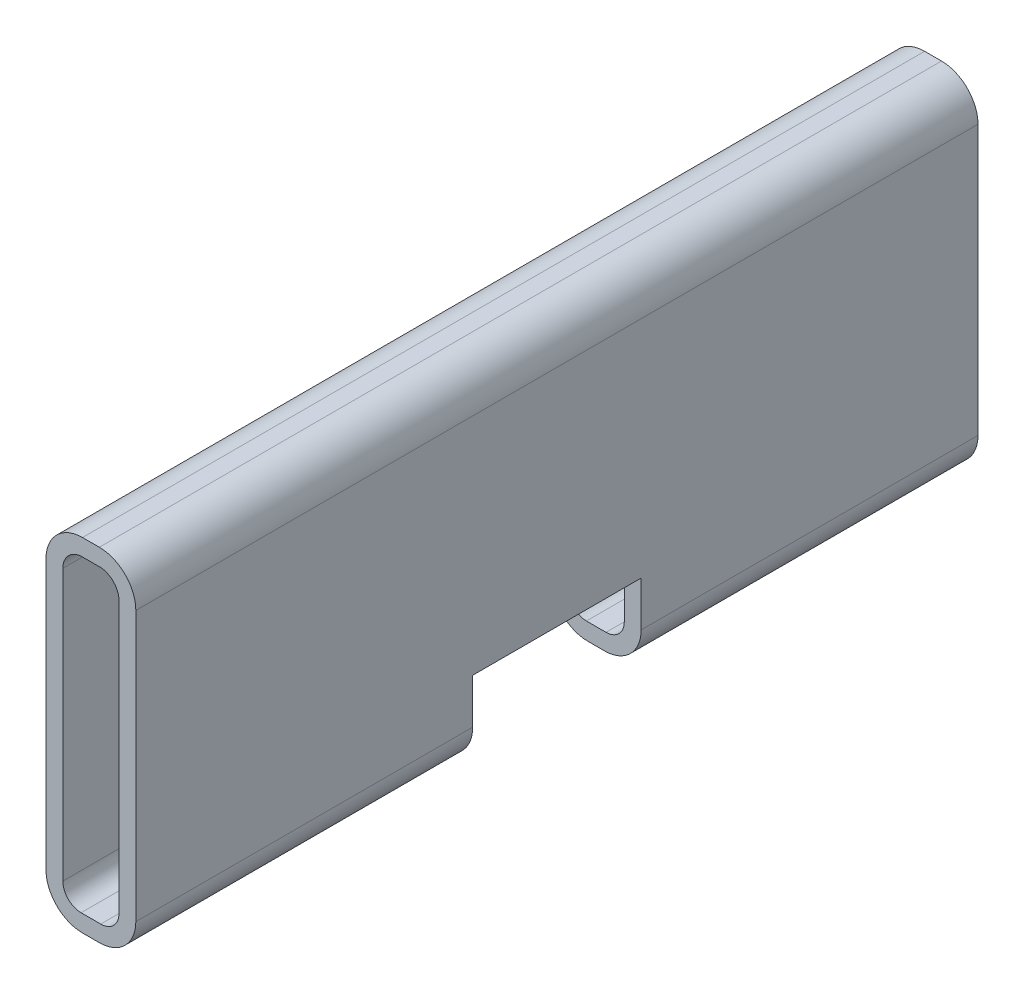
ISO-10303-21;
HEADER;
FILE_DESCRIPTION(('STEP AP214'),'2;1');
FILE_NAME('part.step','',(''),(''),'','','');
FILE_SCHEMA(('AUTOMOTIVE_DESIGN { 1 0 10303 214 1 1 1 1 }'));
ENDSEC;
DATA;
#1=APPLICATION_CONTEXT('core data for automotive mechanical design processes');
#2=APPLICATION_PROTOCOL_DEFINITION('international standard','automotive_design',2000,#1);
#3=PRODUCT_CONTEXT('',#1,'mechanical');
#4=PRODUCT('Part','Part','',(#3));
#5=PRODUCT_RELATED_PRODUCT_CATEGORY('part','',(#4));
#6=PRODUCT_DEFINITION_FORMATION('','',#4);
#7=PRODUCT_DEFINITION_CONTEXT('part definition',#1,'design');
#8=PRODUCT_DEFINITION('design','',#6,#7);
#9=PRODUCT_DEFINITION_SHAPE('','',#8);
#10=(LENGTH_UNIT() NAMED_UNIT(*) SI_UNIT(.MILLI.,.METRE.));
#11=(NAMED_UNIT(*) PLANE_ANGLE_UNIT() SI_UNIT($,.RADIAN.));
#12=(NAMED_UNIT(*) SI_UNIT($,.STERADIAN.) SOLID_ANGLE_UNIT());
#13=UNCERTAINTY_MEASURE_WITH_UNIT(LENGTH_MEASURE(1.E-05),#10,'distance_accuracy_value','');
#14=(GEOMETRIC_REPRESENTATION_CONTEXT(3) GLOBAL_UNCERTAINTY_ASSIGNED_CONTEXT((#13)) GLOBAL_UNIT_ASSIGNED_CONTEXT((#10,
#11,#12)) REPRESENTATION_CONTEXT('',''));
#15=CARTESIAN_POINT('',(0.,0.,0.));
#16=DIRECTION('',(0.,0.,1.));
#17=DIRECTION('',(1.,0.,0.));
#18=AXIS2_PLACEMENT_3D('',#15,#16,#17);
#19=CARTESIAN_POINT('',(0.,0.,60.));
#20=DIRECTION('',(0.,0.,1.));
#21=DIRECTION('',(1.,0.,0.));
#22=AXIS2_PLACEMENT_3D('',#19,#20,#21);
#23=PLANE('',#22);
#24=DIRECTION('',(1.,0.,0.));
#25=VECTOR('',#24,1.);
#26=CARTESIAN_POINT('',(-16.,14.5,60.));
#27=LINE('',#26,#25);
#28=CARTESIAN_POINT('',(-16.,14.5,60.));
#29=VERTEX_POINT('',#28);
#30=CARTESIAN_POINT('',(-13.,14.5,60.));
#31=VERTEX_POINT('',#30);
#32=EDGE_CURVE('E346',#29,#31,#27,.T.);
#33=ORIENTED_EDGE('',*,*,#32,.F.);
#34=DIRECTION('',(0.,-1.,0.));
#35=VECTOR('',#34,1.);
#36=CARTESIAN_POINT('',(-16.,0.,60.));
#37=LINE('',#36,#35);
#38=CARTESIAN_POINT('',(-16.,6.5,60.));
#39=VERTEX_POINT('',#38);
#40=EDGE_CURVE('E403',#29,#39,#37,.T.);
#41=ORIENTED_EDGE('',*,*,#40,.T.);
#42=CARTESIAN_POINT('',(-9.5,6.5,60.));
#43=DIRECTION('',(0.,0.,1.));
#44=DIRECTION('',(1.,0.,0.));
#45=AXIS2_PLACEMENT_3D('',#42,#43,#44);
#46=CIRCLE('',#45,6.5);
#47=CARTESIAN_POINT('',(-9.5,0.,60.));
#48=VERTEX_POINT('',#47);
#49=EDGE_CURVE('E440',#39,#48,#46,.T.);
#50=ORIENTED_EDGE('',*,*,#49,.T.);
#51=DIRECTION('',(1.,0.,0.));
#52=VECTOR('',#51,1.);
#53=CARTESIAN_POINT('',(0.,0.,60.));
#54=LINE('',#53,#52);
#55=CARTESIAN_POINT('',(-6.5,0.,60.));
#56=VERTEX_POINT('',#55);
#57=EDGE_CURVE('E406',#48,#56,#54,.T.);
#58=ORIENTED_EDGE('',*,*,#57,.T.);
#59=CARTESIAN_POINT('',(-6.5,6.5,60.));
#60=DIRECTION('',(0.,0.,1.));
#61=DIRECTION('',(1.,0.,0.));
#62=AXIS2_PLACEMENT_3D('',#59,#60,#61);
#63=CIRCLE('',#62,6.5);
#64=CARTESIAN_POINT('',(0.,6.5,60.));
#65=VERTEX_POINT('',#64);
#66=EDGE_CURVE('E438',#56,#65,#63,.T.);
#67=ORIENTED_EDGE('',*,*,#66,.T.);
#68=DIRECTION('',(0.,1.,0.));
#69=VECTOR('',#68,1.);
#70=CARTESIAN_POINT('',(0.,0.,60.));
#71=LINE('',#70,#69);
#72=CARTESIAN_POINT('',(0.,14.5,60.));
#73=VERTEX_POINT('',#72);
#74=EDGE_CURVE('E401',#65,#73,#71,.T.);
#75=ORIENTED_EDGE('',*,*,#74,.T.);
#76=DIRECTION('',(1.,0.,0.));
#77=VECTOR('',#76,1.);
#78=CARTESIAN_POINT('',(0.,14.5,60.));
#79=LINE('',#78,#77);
#80=CARTESIAN_POINT('',(-3.,14.5,60.));
#81=VERTEX_POINT('',#80);
#82=EDGE_CURVE('E351',#81,#73,#79,.T.);
#83=ORIENTED_EDGE('',*,*,#82,.F.);
#84=DIRECTION('',(0.,1.,0.));
#85=VECTOR('',#84,1.);
#86=CARTESIAN_POINT('',(-3.,3.,60.));
#87=LINE('',#86,#85);
#88=CARTESIAN_POINT('',(-3.,6.25,60.));
#89=VERTEX_POINT('',#88);
#90=EDGE_CURVE('E381',#89,#81,#87,.T.);
#91=ORIENTED_EDGE('',*,*,#90,.F.);
#92=CARTESIAN_POINT('',(-6.25,6.25,60.));
#93=DIRECTION('',(0.,0.,1.));
#94=DIRECTION('',(1.,0.,0.));
#95=AXIS2_PLACEMENT_3D('',#92,#93,#94);
#96=CIRCLE('',#95,3.25);
#97=CARTESIAN_POINT('',(-6.25,3.,60.));
#98=VERTEX_POINT('',#97);
#99=EDGE_CURVE('E474',#89,#98,#96,.F.);
#100=ORIENTED_EDGE('',*,*,#99,.T.);
#101=DIRECTION('',(1.,0.,0.));
#102=VECTOR('',#101,1.);
#103=CARTESIAN_POINT('',(-3.,3.,60.));
#104=LINE('',#103,#102);
#105=CARTESIAN_POINT('',(-9.75,3.,60.));
#106=VERTEX_POINT('',#105);
#107=EDGE_CURVE('E386',#106,#98,#104,.T.);
#108=ORIENTED_EDGE('',*,*,#107,.F.);
#109=CARTESIAN_POINT('',(-9.75,6.25,60.));
#110=DIRECTION('',(0.,0.,1.));
#111=DIRECTION('',(1.,0.,0.));
#112=AXIS2_PLACEMENT_3D('',#109,#110,#111);
#113=CIRCLE('',#112,3.25);
#114=CARTESIAN_POINT('',(-13.,6.25,60.));
#115=VERTEX_POINT('',#114);
#116=EDGE_CURVE('E478',#106,#115,#113,.F.);
#117=ORIENTED_EDGE('',*,*,#116,.T.);
#118=DIRECTION('',(0.,-1.,0.));
#119=VECTOR('',#118,1.);
#120=CARTESIAN_POINT('',(-13.,3.,60.));
#121=LINE('',#120,#119);
#122=EDGE_CURVE('E54',#31,#115,#121,.T.);
#123=ORIENTED_EDGE('',*,*,#122,.F.);
#124=EDGE_LOOP('',(#33,#41,#50,#58,#67,#75,#83,#91,#100,#108,#117,#123));
#125=FACE_BOUND('',#124,.T.);
#126=ADVANCED_FACE('F39',(#125),#23,.T.);
#127=CARTESIAN_POINT('',(0.,0.,0.));
#128=DIRECTION('',(0.,0.,1.));
#129=DIRECTION('',(1.,0.,0.));
#130=AXIS2_PLACEMENT_3D('',#127,#128,#129);
#131=PLANE('',#130);
#132=DIRECTION('',(0.,-1.,0.));
#133=VECTOR('',#132,1.);
#134=CARTESIAN_POINT('',(-16.,0.,0.));
#135=LINE('',#134,#133);
#136=CARTESIAN_POINT('',(-16.,54.5,0.));
#137=VERTEX_POINT('',#136);
#138=CARTESIAN_POINT('',(-16.,6.5,0.));
#139=VERTEX_POINT('',#138);
#140=EDGE_CURVE('E415',#137,#139,#135,.T.);
#141=ORIENTED_EDGE('',*,*,#140,.F.);
#142=CARTESIAN_POINT('',(-9.5,54.5,0.));
#143=DIRECTION('',(0.,0.,1.));
#144=DIRECTION('',(1.,0.,0.));
#145=AXIS2_PLACEMENT_3D('',#142,#143,#144);
#146=CIRCLE('',#145,6.5);
#147=CARTESIAN_POINT('',(-9.5,61.,0.));
#148=VERTEX_POINT('',#147);
#149=EDGE_CURVE('E431',#137,#148,#146,.F.);
#150=ORIENTED_EDGE('',*,*,#149,.T.);
#151=DIRECTION('',(-1.,0.,0.));
#152=VECTOR('',#151,1.);
#153=CARTESIAN_POINT('',(0.,61.,0.));
#154=LINE('',#153,#152);
#155=CARTESIAN_POINT('',(-6.49999999999999,61.,0.));
#156=VERTEX_POINT('',#155);
#157=EDGE_CURVE('E412',#156,#148,#154,.T.);
#158=ORIENTED_EDGE('',*,*,#157,.F.);
#159=CARTESIAN_POINT('',(-6.5,54.5,0.));
#160=DIRECTION('',(0.,0.,1.));
#161=DIRECTION('',(1.,0.,0.));
#162=AXIS2_PLACEMENT_3D('',#159,#160,#161);
#163=CIRCLE('',#162,6.5);
#164=CARTESIAN_POINT('',(0.,54.5,0.));
#165=VERTEX_POINT('',#164);
#166=EDGE_CURVE('E425',#156,#165,#163,.F.);
#167=ORIENTED_EDGE('',*,*,#166,.T.);
#168=DIRECTION('',(0.,1.,0.));
#169=VECTOR('',#168,1.);
#170=CARTESIAN_POINT('',(0.,0.,0.));
#171=LINE('',#170,#169);
#172=CARTESIAN_POINT('',(0.,6.5,0.));
#173=VERTEX_POINT('',#172);
#174=EDGE_CURVE('E389',#173,#165,#171,.T.);
#175=ORIENTED_EDGE('',*,*,#174,.F.);
#176=CARTESIAN_POINT('',(-6.5,6.5,0.));
#177=DIRECTION('',(0.,0.,1.));
#178=DIRECTION('',(1.,0.,0.));
#179=AXIS2_PLACEMENT_3D('',#176,#177,#178);
#180=CIRCLE('',#179,6.5);
#181=CARTESIAN_POINT('',(-6.5,0.,0.));
#182=VERTEX_POINT('',#181);
#183=EDGE_CURVE('E427',#173,#182,#180,.F.);
#184=ORIENTED_EDGE('',*,*,#183,.T.);
#185=DIRECTION('',(1.,0.,0.));
#186=VECTOR('',#185,1.);
#187=CARTESIAN_POINT('',(0.,0.,0.));
#188=LINE('',#187,#186);
#189=CARTESIAN_POINT('',(-9.5,0.,0.));
#190=VERTEX_POINT('',#189);
#191=EDGE_CURVE('E404',#190,#182,#188,.T.);
#192=ORIENTED_EDGE('',*,*,#191,.F.);
#193=CARTESIAN_POINT('',(-9.5,6.5,0.));
#194=DIRECTION('',(0.,0.,1.));
#195=DIRECTION('',(1.,0.,0.));
#196=AXIS2_PLACEMENT_3D('',#193,#194,#195);
#197=CIRCLE('',#196,6.5);
#198=EDGE_CURVE('E429',#190,#139,#197,.F.);
#199=ORIENTED_EDGE('',*,*,#198,.T.);
#200=EDGE_LOOP('',(#141,#150,#158,#167,#175,#184,#192,#199));
#201=FACE_BOUND('',#200,.T.);
#202=DIRECTION('',(1.,0.,0.));
#203=VECTOR('',#202,1.);
#204=CARTESIAN_POINT('',(-3.,3.,0.));
#205=LINE('',#204,#203);
#206=CARTESIAN_POINT('',(-9.75,3.,0.));
#207=VERTEX_POINT('',#206);
#208=CARTESIAN_POINT('',(-6.25,3.,0.));
#209=VERTEX_POINT('',#208);
#210=EDGE_CURVE('E398',#207,#209,#205,.T.);
#211=ORIENTED_EDGE('',*,*,#210,.T.);
#212=CARTESIAN_POINT('',(-6.25,6.25,0.));
#213=DIRECTION('',(0.,0.,1.));
#214=DIRECTION('',(1.,0.,0.));
#215=AXIS2_PLACEMENT_3D('',#212,#213,#214);
#216=CIRCLE('',#215,3.25);
#217=CARTESIAN_POINT('',(-3.,6.25,0.));
#218=VERTEX_POINT('',#217);
#219=EDGE_CURVE('E472',#209,#218,#216,.T.);
#220=ORIENTED_EDGE('',*,*,#219,.T.);
#221=DIRECTION('',(0.,1.,0.));
#222=VECTOR('',#221,1.);
#223=CARTESIAN_POINT('',(-3.,3.,0.));
#224=LINE('',#223,#222);
#225=CARTESIAN_POINT('',(-3.,54.75,0.));
#226=VERTEX_POINT('',#225);
#227=EDGE_CURVE('E380',#218,#226,#224,.T.);
#228=ORIENTED_EDGE('',*,*,#227,.T.);
#229=CARTESIAN_POINT('',(-6.25,54.75,0.));
#230=DIRECTION('',(0.,0.,1.));
#231=DIRECTION('',(1.,0.,0.));
#232=AXIS2_PLACEMENT_3D('',#229,#230,#231);
#233=CIRCLE('',#232,3.25);
#234=CARTESIAN_POINT('',(-6.25,58.,0.));
#235=VERTEX_POINT('',#234);
#236=EDGE_CURVE('E480',#226,#235,#233,.T.);
#237=ORIENTED_EDGE('',*,*,#236,.T.);
#238=DIRECTION('',(-1.,0.,0.));
#239=VECTOR('',#238,1.);
#240=CARTESIAN_POINT('',(-3.,58.,0.));
#241=LINE('',#240,#239);
#242=CARTESIAN_POINT('',(-9.74999999999999,58.,0.));
#243=VERTEX_POINT('',#242);
#244=EDGE_CURVE('E392',#235,#243,#241,.T.);
#245=ORIENTED_EDGE('',*,*,#244,.T.);
#246=CARTESIAN_POINT('',(-9.75,54.75,0.));
#247=DIRECTION('',(0.,0.,1.));
#248=DIRECTION('',(1.,0.,0.));
#249=AXIS2_PLACEMENT_3D('',#246,#247,#248);
#250=CIRCLE('',#249,3.25);
#251=CARTESIAN_POINT('',(-13.,54.75,0.));
#252=VERTEX_POINT('',#251);
#253=EDGE_CURVE('E47',#243,#252,#250,.T.);
#254=ORIENTED_EDGE('',*,*,#253,.T.);
#255=DIRECTION('',(0.,-1.,0.));
#256=VECTOR('',#255,1.);
#257=CARTESIAN_POINT('',(-13.,3.,0.));
#258=LINE('',#257,#256);
#259=CARTESIAN_POINT('',(-13.,6.25,0.));
#260=VERTEX_POINT('',#259);
#261=EDGE_CURVE('E395',#252,#260,#258,.T.);
#262=ORIENTED_EDGE('',*,*,#261,.T.);
#263=CARTESIAN_POINT('',(-9.75,6.25,0.));
#264=DIRECTION('',(0.,0.,1.));
#265=DIRECTION('',(1.,0.,0.));
#266=AXIS2_PLACEMENT_3D('',#263,#264,#265);
#267=CIRCLE('',#266,3.25);
#268=EDGE_CURVE('E476',#260,#207,#267,.T.);
#269=ORIENTED_EDGE('',*,*,#268,.T.);
#270=EDGE_LOOP('',(#211,#220,#228,#237,#245,#254,#262,#269));
#271=FACE_BOUND('',#270,.T.);
#272=ADVANCED_FACE('F486',(#201,#271),#131,.F.);
#273=CARTESIAN_POINT('',(0.,0.,60.));
#274=DIRECTION('',(-1.,0.,0.));
#275=DIRECTION('',(0.,0.,1.));
#276=AXIS2_PLACEMENT_3D('',#273,#274,#275);
#277=PLANE('',#276);
#278=ORIENTED_EDGE('',*,*,#74,.F.);
#279=DIRECTION('',(0.,0.,-1.));
#280=VECTOR('',#279,1.);
#281=CARTESIAN_POINT('',(0.,6.5,60.));
#282=LINE('',#281,#280);
#283=EDGE_CURVE('E449',#65,#173,#282,.T.);
#284=ORIENTED_EDGE('',*,*,#283,.T.);
#285=ORIENTED_EDGE('',*,*,#174,.T.);
#286=DIRECTION('',(0.,0.,-1.));
#287=VECTOR('',#286,1.);
#288=CARTESIAN_POINT('',(0.,54.5,60.));
#289=LINE('',#288,#287);
#290=CARTESIAN_POINT('',(0.,54.5,150.));
#291=VERTEX_POINT('',#290);
#292=EDGE_CURVE('E447',#165,#291,#289,.F.);
#293=ORIENTED_EDGE('',*,*,#292,.T.);
#294=DIRECTION('',(0.,1.,0.));
#295=VECTOR('',#294,1.);
#296=CARTESIAN_POINT('',(0.,54.5,150.));
#297=LINE('',#296,#295);
#298=CARTESIAN_POINT('',(0.,6.5,150.));
#299=VERTEX_POINT('',#298);
#300=EDGE_CURVE('E310',#299,#291,#297,.T.);
#301=ORIENTED_EDGE('',*,*,#300,.F.);
#302=DIRECTION('',(0.,0.,-1.));
#303=VECTOR('',#302,1.);
#304=CARTESIAN_POINT('',(0.,6.5,150.));
#305=LINE('',#304,#303);
#306=CARTESIAN_POINT('',(0.,6.5,90.));
#307=VERTEX_POINT('',#306);
#308=EDGE_CURVE('E337',#299,#307,#305,.T.);
#309=ORIENTED_EDGE('',*,*,#308,.T.);
#310=DIRECTION('',(0.,1.,0.));
#311=VECTOR('',#310,1.);
#312=CARTESIAN_POINT('',(0.,54.5,90.));
#313=LINE('',#312,#311);
#314=CARTESIAN_POINT('',(0.,14.5,90.));
#315=VERTEX_POINT('',#314);
#316=EDGE_CURVE('E331',#307,#315,#313,.T.);
#317=ORIENTED_EDGE('',*,*,#316,.T.);
#318=DIRECTION('',(0.,0.,-1.));
#319=VECTOR('',#318,1.);
#320=CARTESIAN_POINT('',(0.,14.5,90.));
#321=LINE('',#320,#319);
#322=EDGE_CURVE('E366',#315,#73,#321,.T.);
#323=ORIENTED_EDGE('',*,*,#322,.T.);
#324=EDGE_LOOP('',(#278,#284,#285,#293,#301,#309,#317,#323));
#325=FACE_BOUND('',#324,.T.);
#326=ADVANCED_FACE('F546',(#325),#277,.F.);
#327=CARTESIAN_POINT('',(0.,61.,60.));
#328=DIRECTION('',(0.,-1.,0.));
#329=DIRECTION('',(1.,0.,0.));
#330=AXIS2_PLACEMENT_3D('',#327,#328,#329);
#331=PLANE('',#330);
#332=ORIENTED_EDGE('',*,*,#157,.T.);
#333=DIRECTION('',(0.,0.,-1.));
#334=VECTOR('',#333,1.);
#335=CARTESIAN_POINT('',(-9.5,61.,60.));
#336=LINE('',#335,#334);
#337=CARTESIAN_POINT('',(-9.5,61.,150.));
#338=VERTEX_POINT('',#337);
#339=EDGE_CURVE('E436',#148,#338,#336,.F.);
#340=ORIENTED_EDGE('',*,*,#339,.T.);
#341=DIRECTION('',(-1.,0.,0.));
#342=VECTOR('',#341,1.);
#343=CARTESIAN_POINT('',(-9.5,61.,150.));
#344=LINE('',#343,#342);
#345=CARTESIAN_POINT('',(-6.50000000000002,61.,150.));
#346=VERTEX_POINT('',#345);
#347=EDGE_CURVE('E316',#346,#338,#344,.T.);
#348=ORIENTED_EDGE('',*,*,#347,.F.);
#349=DIRECTION('',(0.,0.,-1.));
#350=VECTOR('',#349,1.);
#351=CARTESIAN_POINT('',(-6.49999999999999,61.,60.));
#352=LINE('',#351,#350);
#353=EDGE_CURVE('E433',#346,#156,#352,.T.);
#354=ORIENTED_EDGE('',*,*,#353,.T.);
#355=EDGE_LOOP('',(#332,#340,#348,#354));
#356=FACE_BOUND('',#355,.T.);
#357=ADVANCED_FACE('F567',(#356),#331,.F.);
#358=CARTESIAN_POINT('',(-16.,0.,60.));
#359=DIRECTION('',(1.,0.,0.));
#360=DIRECTION('',(0.,0.,-1.));
#361=AXIS2_PLACEMENT_3D('',#358,#359,#360);
#362=PLANE('',#361);
#363=ORIENTED_EDGE('',*,*,#40,.F.);
#364=DIRECTION('',(0.,0.,-1.));
#365=VECTOR('',#364,1.);
#366=CARTESIAN_POINT('',(-16.,14.5,90.));
#367=LINE('',#366,#365);
#368=CARTESIAN_POINT('',(-16.,14.5,90.));
#369=VERTEX_POINT('',#368);
#370=EDGE_CURVE('E354',#369,#29,#367,.T.);
#371=ORIENTED_EDGE('',*,*,#370,.F.);
#372=DIRECTION('',(0.,-1.,0.));
#373=VECTOR('',#372,1.);
#374=CARTESIAN_POINT('',(-16.,6.5,90.));
#375=LINE('',#374,#373);
#376=CARTESIAN_POINT('',(-16.,6.5,90.));
#377=VERTEX_POINT('',#376);
#378=EDGE_CURVE('E306',#369,#377,#375,.T.);
#379=ORIENTED_EDGE('',*,*,#378,.T.);
#380=DIRECTION('',(0.,0.,-1.));
#381=VECTOR('',#380,1.);
#382=CARTESIAN_POINT('',(-16.,6.5,150.));
#383=LINE('',#382,#381);
#384=CARTESIAN_POINT('',(-16.,6.5,150.));
#385=VERTEX_POINT('',#384);
#386=EDGE_CURVE('E324',#385,#377,#383,.T.);
#387=ORIENTED_EDGE('',*,*,#386,.F.);
#388=DIRECTION('',(0.,-1.,0.));
#389=VECTOR('',#388,1.);
#390=CARTESIAN_POINT('',(-16.,6.5,150.));
#391=LINE('',#390,#389);
#392=CARTESIAN_POINT('',(-16.,54.5,150.));
#393=VERTEX_POINT('',#392);
#394=EDGE_CURVE('E322',#393,#385,#391,.T.);
#395=ORIENTED_EDGE('',*,*,#394,.F.);
#396=DIRECTION('',(0.,0.,-1.));
#397=VECTOR('',#396,1.);
#398=CARTESIAN_POINT('',(-16.,54.5,60.));
#399=LINE('',#398,#397);
#400=EDGE_CURVE('E422',#393,#137,#399,.T.);
#401=ORIENTED_EDGE('',*,*,#400,.T.);
#402=ORIENTED_EDGE('',*,*,#140,.T.);
#403=DIRECTION('',(0.,0.,-1.));
#404=VECTOR('',#403,1.);
#405=CARTESIAN_POINT('',(-16.,6.5,60.));
#406=LINE('',#405,#404);
#407=EDGE_CURVE('E409',#139,#39,#406,.F.);
#408=ORIENTED_EDGE('',*,*,#407,.T.);
#409=EDGE_LOOP('',(#363,#371,#379,#387,#395,#401,#402,#408));
#410=FACE_BOUND('',#409,.T.);
#411=ADVANCED_FACE('F528',(#410),#362,.F.);
#412=CARTESIAN_POINT('',(0.,0.,60.));
#413=DIRECTION('',(0.,1.,0.));
#414=DIRECTION('',(-1.,0.,0.));
#415=AXIS2_PLACEMENT_3D('',#412,#413,#414);
#416=PLANE('',#415);
#417=ORIENTED_EDGE('',*,*,#57,.F.);
#418=DIRECTION('',(0.,0.,-1.));
#419=VECTOR('',#418,1.);
#420=CARTESIAN_POINT('',(-9.5,0.,60.));
#421=LINE('',#420,#419);
#422=EDGE_CURVE('E444',#48,#190,#421,.T.);
#423=ORIENTED_EDGE('',*,*,#422,.T.);
#424=ORIENTED_EDGE('',*,*,#191,.T.);
#425=DIRECTION('',(0.,0.,-1.));
#426=VECTOR('',#425,1.);
#427=CARTESIAN_POINT('',(-6.5,0.,60.));
#428=LINE('',#427,#426);
#429=EDGE_CURVE('E442',#182,#56,#428,.F.);
#430=ORIENTED_EDGE('',*,*,#429,.T.);
#431=EDGE_LOOP('',(#417,#423,#424,#430));
#432=FACE_BOUND('',#431,.T.);
#433=ADVANCED_FACE('F538',(#432),#416,.F.);
#434=CARTESIAN_POINT('',(-3.,3.,60.));
#435=DIRECTION('',(-1.,0.,0.));
#436=DIRECTION('',(0.,-1.,0.));
#437=AXIS2_PLACEMENT_3D('',#434,#435,#436);
#438=PLANE('',#437);
#439=ORIENTED_EDGE('',*,*,#227,.F.);
#440=DIRECTION('',(0.,0.,-1.));
#441=VECTOR('',#440,1.);
#442=CARTESIAN_POINT('',(-3.,6.25,60.));
#443=LINE('',#442,#441);
#444=EDGE_CURVE('E460',#218,#89,#443,.F.);
#445=ORIENTED_EDGE('',*,*,#444,.T.);
#446=ORIENTED_EDGE('',*,*,#90,.T.);
#447=DIRECTION('',(0.,0.,-1.));
#448=VECTOR('',#447,1.);
#449=CARTESIAN_POINT('',(-3.,14.5,90.));
#450=LINE('',#449,#448);
#451=CARTESIAN_POINT('',(-3.,14.5,90.));
#452=VERTEX_POINT('',#451);
#453=EDGE_CURVE('E369',#452,#81,#450,.T.);
#454=ORIENTED_EDGE('',*,*,#453,.F.);
#455=DIRECTION('',(0.,1.,0.));
#456=VECTOR('',#455,1.);
#457=CARTESIAN_POINT('',(-3.,6.25,90.));
#458=LINE('',#457,#456);
#459=CARTESIAN_POINT('',(-3.,6.25,90.));
#460=VERTEX_POINT('',#459);
#461=EDGE_CURVE('E259',#460,#452,#458,.T.);
#462=ORIENTED_EDGE('',*,*,#461,.F.);
#463=DIRECTION('',(0.,0.,-1.));
#464=VECTOR('',#463,1.);
#465=CARTESIAN_POINT('',(-3.,6.25,150.));
#466=LINE('',#465,#464);
#467=CARTESIAN_POINT('',(-3.,6.25,150.));
#468=VERTEX_POINT('',#467);
#469=EDGE_CURVE('E280',#468,#460,#466,.T.);
#470=ORIENTED_EDGE('',*,*,#469,.F.);
#471=DIRECTION('',(0.,1.,0.));
#472=VECTOR('',#471,1.);
#473=CARTESIAN_POINT('',(-3.,6.25,150.));
#474=LINE('',#473,#472);
#475=CARTESIAN_POINT('',(-3.,54.5,150.));
#476=VERTEX_POINT('',#475);
#477=EDGE_CURVE('E272',#468,#476,#474,.T.);
#478=ORIENTED_EDGE('',*,*,#477,.T.);
#479=DIRECTION('',(0.,0.,-1.));
#480=VECTOR('',#479,1.);
#481=CARTESIAN_POINT('',(-3.,54.5,90.));
#482=LINE('',#481,#480);
#483=CARTESIAN_POINT('',(-3.,54.5,60.));
#484=VERTEX_POINT('',#483);
#485=EDGE_CURVE('E372',#476,#484,#482,.T.);
#486=ORIENTED_EDGE('',*,*,#485,.T.);
#487=CARTESIAN_POINT('',(-3.,54.75,60.));
#488=VERTEX_POINT('',#487);
#489=EDGE_CURVE('E384',#484,#488,#87,.T.);
#490=ORIENTED_EDGE('',*,*,#489,.T.);
#491=DIRECTION('',(0.,0.,-1.));
#492=VECTOR('',#491,1.);
#493=CARTESIAN_POINT('',(-3.,54.75,0.));
#494=LINE('',#493,#492);
#495=EDGE_CURVE('E457',#488,#226,#494,.T.);
#496=ORIENTED_EDGE('',*,*,#495,.T.);
#497=EDGE_LOOP('',(#439,#445,#446,#454,#462,#470,#478,#486,#490,#496));
#498=FACE_BOUND('',#497,.T.);
#499=ADVANCED_FACE('F505',(#498),#438,.T.);
#500=CARTESIAN_POINT('',(-3.,58.,60.));
#501=DIRECTION('',(0.,-1.,0.));
#502=DIRECTION('',(1.,0.,0.));
#503=AXIS2_PLACEMENT_3D('',#500,#501,#502);
#504=PLANE('',#503);
#505=ORIENTED_EDGE('',*,*,#244,.F.);
#506=DIRECTION('',(0.,0.,-1.));
#507=VECTOR('',#506,1.);
#508=CARTESIAN_POINT('',(-6.25,58.,60.));
#509=LINE('',#508,#507);
#510=CARTESIAN_POINT('',(-6.25,58.,60.));
#511=VERTEX_POINT('',#510);
#512=EDGE_CURVE('E470',#235,#511,#509,.F.);
#513=ORIENTED_EDGE('',*,*,#512,.T.);
#514=DIRECTION('',(0.,0.,-1.));
#515=VECTOR('',#514,1.);
#516=CARTESIAN_POINT('',(-6.25,58.,90.));
#517=LINE('',#516,#515);
#518=CARTESIAN_POINT('',(-6.25,58.,150.));
#519=VERTEX_POINT('',#518);
#520=EDGE_CURVE('E375',#519,#511,#517,.T.);
#521=ORIENTED_EDGE('',*,*,#520,.F.);
#522=DIRECTION('',(-1.,0.,0.));
#523=VECTOR('',#522,1.);
#524=CARTESIAN_POINT('',(-9.74999999999999,58.,150.));
#525=LINE('',#524,#523);
#526=CARTESIAN_POINT('',(-9.74999999999999,58.,150.));
#527=VERTEX_POINT('',#526);
#528=EDGE_CURVE('E278',#519,#527,#525,.T.);
#529=ORIENTED_EDGE('',*,*,#528,.T.);
#530=DIRECTION('',(0.,0.,-1.));
#531=VECTOR('',#530,1.);
#532=CARTESIAN_POINT('',(-9.74999999999999,58.,90.));
#533=LINE('',#532,#531);
#534=CARTESIAN_POINT('',(-9.74999999999999,58.,60.));
#535=VERTEX_POINT('',#534);
#536=EDGE_CURVE('E250',#527,#535,#533,.T.);
#537=ORIENTED_EDGE('',*,*,#536,.T.);
#538=DIRECTION('',(0.,0.,-1.));
#539=VECTOR('',#538,1.);
#540=CARTESIAN_POINT('',(-9.74999999999999,58.,0.));
#541=LINE('',#540,#539);
#542=EDGE_CURVE('E467',#535,#243,#541,.T.);
#543=ORIENTED_EDGE('',*,*,#542,.T.);
#544=EDGE_LOOP('',(#505,#513,#521,#529,#537,#543));
#545=FACE_BOUND('',#544,.T.);
#546=ADVANCED_FACE('F495',(#545),#504,.T.);
#547=CARTESIAN_POINT('',(-13.,3.,60.));
#548=DIRECTION('',(1.,0.,0.));
#549=DIRECTION('',(0.,1.,0.));
#550=AXIS2_PLACEMENT_3D('',#547,#548,#549);
#551=PLANE('',#550);
#552=CARTESIAN_POINT('',(-13.,54.75,60.));
#553=VERTEX_POINT('',#552);
#554=CARTESIAN_POINT('',(-13.,54.5,60.));
#555=VERTEX_POINT('',#554);
#556=EDGE_CURVE('E62',#553,#555,#121,.T.);
#557=ORIENTED_EDGE('',*,*,#556,.T.);
#558=DIRECTION('',(0.,0.,-1.));
#559=VECTOR('',#558,1.);
#560=CARTESIAN_POINT('',(-13.,54.5,90.));
#561=LINE('',#560,#559);
#562=CARTESIAN_POINT('',(-13.,54.5,150.));
#563=VERTEX_POINT('',#562);
#564=EDGE_CURVE('E239',#563,#555,#561,.T.);
#565=ORIENTED_EDGE('',*,*,#564,.F.);
#566=DIRECTION('',(0.,-1.,0.));
#567=VECTOR('',#566,1.);
#568=CARTESIAN_POINT('',(-13.,54.5,150.));
#569=LINE('',#568,#567);
#570=CARTESIAN_POINT('',(-13.,6.25,150.));
#571=VERTEX_POINT('',#570);
#572=EDGE_CURVE('E244',#563,#571,#569,.T.);
#573=ORIENTED_EDGE('',*,*,#572,.T.);
#574=DIRECTION('',(0.,0.,-1.));
#575=VECTOR('',#574,1.);
#576=CARTESIAN_POINT('',(-13.,6.25,150.));
#577=LINE('',#576,#575);
#578=CARTESIAN_POINT('',(-13.,6.25,90.));
#579=VERTEX_POINT('',#578);
#580=EDGE_CURVE('E299',#571,#579,#577,.T.);
#581=ORIENTED_EDGE('',*,*,#580,.T.);
#582=DIRECTION('',(0.,-1.,0.));
#583=VECTOR('',#582,1.);
#584=CARTESIAN_POINT('',(-13.,54.5,90.));
#585=LINE('',#584,#583);
#586=CARTESIAN_POINT('',(-13.,14.5,90.));
#587=VERTEX_POINT('',#586);
#588=EDGE_CURVE('E281',#587,#579,#585,.T.);
#589=ORIENTED_EDGE('',*,*,#588,.F.);
#590=DIRECTION('',(0.,0.,-1.));
#591=VECTOR('',#590,1.);
#592=CARTESIAN_POINT('',(-13.,14.5,90.));
#593=LINE('',#592,#591);
#594=EDGE_CURVE('E249',#587,#31,#593,.T.);
#595=ORIENTED_EDGE('',*,*,#594,.T.);
#596=ORIENTED_EDGE('',*,*,#122,.T.);
#597=DIRECTION('',(0.,0.,-1.));
#598=VECTOR('',#597,1.);
#599=CARTESIAN_POINT('',(-13.,6.25,0.));
#600=LINE('',#599,#598);
#601=EDGE_CURVE('E464',#115,#260,#600,.T.);
#602=ORIENTED_EDGE('',*,*,#601,.T.);
#603=ORIENTED_EDGE('',*,*,#261,.F.);
#604=DIRECTION('',(0.,0.,-1.));
#605=VECTOR('',#604,1.);
#606=CARTESIAN_POINT('',(-13.,54.75,60.));
#607=LINE('',#606,#605);
#608=EDGE_CURVE('E462',#252,#553,#607,.F.);
#609=ORIENTED_EDGE('',*,*,#608,.T.);
#610=EDGE_LOOP('',(#557,#565,#573,#581,#589,#595,#596,#602,#603,#609));
#611=FACE_BOUND('',#610,.T.);
#612=ADVANCED_FACE('F241',(#611),#551,.T.);
#613=CARTESIAN_POINT('',(-3.,3.,60.));
#614=DIRECTION('',(0.,1.,0.));
#615=DIRECTION('',(-1.,0.,0.));
#616=AXIS2_PLACEMENT_3D('',#613,#614,#615);
#617=PLANE('',#616);
#618=ORIENTED_EDGE('',*,*,#107,.T.);
#619=DIRECTION('',(0.,0.,-1.));
#620=VECTOR('',#619,1.);
#621=CARTESIAN_POINT('',(-6.25,3.,0.));
#622=LINE('',#621,#620);
#623=EDGE_CURVE('E454',#98,#209,#622,.T.);
#624=ORIENTED_EDGE('',*,*,#623,.T.);
#625=ORIENTED_EDGE('',*,*,#210,.F.);
#626=DIRECTION('',(0.,0.,-1.));
#627=VECTOR('',#626,1.);
#628=CARTESIAN_POINT('',(-9.75,3.,60.));
#629=LINE('',#628,#627);
#630=EDGE_CURVE('E452',#207,#106,#629,.F.);
#631=ORIENTED_EDGE('',*,*,#630,.T.);
#632=EDGE_LOOP('',(#618,#624,#625,#631));
#633=FACE_BOUND('',#632,.T.);
#634=ADVANCED_FACE('F608',(#633),#617,.T.);
#635=CARTESIAN_POINT('',(-9.5,54.5,60.));
#636=DIRECTION('',(0.,0.,-1.));
#637=DIRECTION('',(-1.,0.,0.));
#638=AXIS2_PLACEMENT_3D('',#635,#636,#637);
#639=CYLINDRICAL_SURFACE('',#638,6.5);
#640=ORIENTED_EDGE('',*,*,#400,.F.);
#641=CARTESIAN_POINT('',(-9.49999999999999,54.5,150.));
#642=DIRECTION('',(0.,0.,1.));
#643=DIRECTION('',(-1.,0.,0.));
#644=AXIS2_PLACEMENT_3D('',#641,#642,#643);
#645=CIRCLE('',#644,6.50000000000001);
#646=EDGE_CURVE('E319',#338,#393,#645,.T.);
#647=ORIENTED_EDGE('',*,*,#646,.F.);
#648=ORIENTED_EDGE('',*,*,#339,.F.);
#649=ORIENTED_EDGE('',*,*,#149,.F.);
#650=EDGE_LOOP('',(#640,#647,#648,#649));
#651=FACE_BOUND('',#650,.T.);
#652=ADVANCED_FACE('F571',(#651),#639,.T.);
#653=CARTESIAN_POINT('',(-9.5,6.5,60.));
#654=DIRECTION('',(0.,0.,-1.));
#655=DIRECTION('',(-1.,0.,0.));
#656=AXIS2_PLACEMENT_3D('',#653,#654,#655);
#657=CYLINDRICAL_SURFACE('',#656,6.5);
#658=ORIENTED_EDGE('',*,*,#49,.F.);
#659=ORIENTED_EDGE('',*,*,#407,.F.);
#660=ORIENTED_EDGE('',*,*,#198,.F.);
#661=ORIENTED_EDGE('',*,*,#422,.F.);
#662=EDGE_LOOP('',(#658,#659,#660,#661));
#663=FACE_BOUND('',#662,.T.);
#664=ADVANCED_FACE('F534',(#663),#657,.T.);
#665=CARTESIAN_POINT('',(-6.5,6.5,60.));
#666=DIRECTION('',(0.,0.,-1.));
#667=DIRECTION('',(-1.,0.,0.));
#668=AXIS2_PLACEMENT_3D('',#665,#666,#667);
#669=CYLINDRICAL_SURFACE('',#668,6.5);
#670=ORIENTED_EDGE('',*,*,#66,.F.);
#671=ORIENTED_EDGE('',*,*,#429,.F.);
#672=ORIENTED_EDGE('',*,*,#183,.F.);
#673=ORIENTED_EDGE('',*,*,#283,.F.);
#674=EDGE_LOOP('',(#670,#671,#672,#673));
#675=FACE_BOUND('',#674,.T.);
#676=ADVANCED_FACE('F542',(#675),#669,.T.);
#677=CARTESIAN_POINT('',(-6.5,54.5,60.));
#678=DIRECTION('',(0.,0.,-1.));
#679=DIRECTION('',(-1.,0.,0.));
#680=AXIS2_PLACEMENT_3D('',#677,#678,#679);
#681=CYLINDRICAL_SURFACE('',#680,6.5);
#682=ORIENTED_EDGE('',*,*,#353,.F.);
#683=CARTESIAN_POINT('',(-6.50000000000001,54.5,150.));
#684=DIRECTION('',(0.,0.,1.));
#685=DIRECTION('',(1.,0.,0.));
#686=AXIS2_PLACEMENT_3D('',#683,#684,#685);
#687=CIRCLE('',#686,6.50000000000001);
#688=EDGE_CURVE('E313',#291,#346,#687,.T.);
#689=ORIENTED_EDGE('',*,*,#688,.F.);
#690=ORIENTED_EDGE('',*,*,#292,.F.);
#691=ORIENTED_EDGE('',*,*,#166,.F.);
#692=EDGE_LOOP('',(#682,#689,#690,#691));
#693=FACE_BOUND('',#692,.T.);
#694=ADVANCED_FACE('F564',(#693),#681,.T.);
#695=CARTESIAN_POINT('',(-6.25,6.25,60.));
#696=DIRECTION('',(0.,0.,1.));
#697=DIRECTION('',(1.,0.,0.));
#698=AXIS2_PLACEMENT_3D('',#695,#696,#697);
#699=CYLINDRICAL_SURFACE('',#698,3.25);
#700=ORIENTED_EDGE('',*,*,#99,.F.);
#701=ORIENTED_EDGE('',*,*,#444,.F.);
#702=ORIENTED_EDGE('',*,*,#219,.F.);
#703=ORIENTED_EDGE('',*,*,#623,.F.);
#704=EDGE_LOOP('',(#700,#701,#702,#703));
#705=FACE_BOUND('',#704,.T.);
#706=ADVANCED_FACE('F615',(#705),#699,.F.);
#707=CARTESIAN_POINT('',(-9.75,6.25,60.));
#708=DIRECTION('',(0.,0.,1.));
#709=DIRECTION('',(1.,0.,0.));
#710=AXIS2_PLACEMENT_3D('',#707,#708,#709);
#711=CYLINDRICAL_SURFACE('',#710,3.25);
#712=ORIENTED_EDGE('',*,*,#116,.F.);
#713=ORIENTED_EDGE('',*,*,#630,.F.);
#714=ORIENTED_EDGE('',*,*,#268,.F.);
#715=ORIENTED_EDGE('',*,*,#601,.F.);
#716=EDGE_LOOP('',(#712,#713,#714,#715));
#717=FACE_BOUND('',#716,.T.);
#718=ADVANCED_FACE('F618',(#717),#711,.F.);
#719=CARTESIAN_POINT('',(-6.25,54.75,60.));
#720=DIRECTION('',(0.,0.,1.));
#721=DIRECTION('',(1.,0.,0.));
#722=AXIS2_PLACEMENT_3D('',#719,#720,#721);
#723=CYLINDRICAL_SURFACE('',#722,3.25);
#724=CARTESIAN_POINT('',(-6.25,54.75,60.));
#725=DIRECTION('',(0.,0.,1.));
#726=DIRECTION('',(1.,0.,0.));
#727=AXIS2_PLACEMENT_3D('',#724,#725,#726);
#728=CIRCLE('',#727,3.25);
#729=EDGE_CURVE('E482',#511,#488,#728,.F.);
#730=ORIENTED_EDGE('',*,*,#729,.F.);
#731=ORIENTED_EDGE('',*,*,#512,.F.);
#732=ORIENTED_EDGE('',*,*,#236,.F.);
#733=ORIENTED_EDGE('',*,*,#495,.F.);
#734=EDGE_LOOP('',(#730,#731,#732,#733));
#735=FACE_BOUND('',#734,.T.);
#736=ADVANCED_FACE('F621',(#735),#723,.F.);
#737=CARTESIAN_POINT('',(-9.75,54.75,60.));
#738=DIRECTION('',(0.,0.,1.));
#739=DIRECTION('',(1.,0.,0.));
#740=AXIS2_PLACEMENT_3D('',#737,#738,#739);
#741=CYLINDRICAL_SURFACE('',#740,3.25);
#742=CARTESIAN_POINT('',(-9.75,54.75,60.));
#743=DIRECTION('',(0.,0.,1.));
#744=DIRECTION('',(1.,0.,0.));
#745=AXIS2_PLACEMENT_3D('',#742,#743,#744);
#746=CIRCLE('',#745,3.25);
#747=EDGE_CURVE('E11',#553,#535,#746,.F.);
#748=ORIENTED_EDGE('',*,*,#747,.F.);
#749=ORIENTED_EDGE('',*,*,#608,.F.);
#750=ORIENTED_EDGE('',*,*,#253,.F.);
#751=ORIENTED_EDGE('',*,*,#542,.F.);
#752=EDGE_LOOP('',(#748,#749,#750,#751));
#753=FACE_BOUND('',#752,.T.);
#754=ADVANCED_FACE('F41',(#753),#741,.F.);
#755=CARTESIAN_POINT('',(-9.49038461538461,54.5,60.));
#756=DIRECTION('',(0.,0.,-1.));
#757=DIRECTION('',(-1.,0.,0.));
#758=AXIS2_PLACEMENT_3D('',#755,#756,#757);
#759=PLANE('',#758);
#760=CARTESIAN_POINT('',(-6.50961538461539,54.5,60.));
#761=DIRECTION('',(0.,0.,-1.));
#762=DIRECTION('',(1.,0.,0.));
#763=AXIS2_PLACEMENT_3D('',#760,#761,#762);
#764=CIRCLE('',#763,3.50961538461539);
#765=EDGE_CURVE('E359',#511,#484,#764,.T.);
#766=ORIENTED_EDGE('',*,*,#765,.F.);
#767=ORIENTED_EDGE('',*,*,#729,.T.);
#768=ORIENTED_EDGE('',*,*,#489,.F.);
#769=EDGE_LOOP('',(#766,#767,#768));
#770=FACE_BOUND('',#769,.T.);
#771=ADVANCED_FACE('F628',(#770),#759,.T.);
#772=CARTESIAN_POINT('',(-16.,14.5,90.));
#773=DIRECTION('',(0.,1.,0.));
#774=DIRECTION('',(0.,0.,1.));
#775=AXIS2_PLACEMENT_3D('',#772,#773,#774);
#776=PLANE('',#775);
#777=ORIENTED_EDGE('',*,*,#32,.T.);
#778=ORIENTED_EDGE('',*,*,#594,.F.);
#779=DIRECTION('',(1.,0.,0.));
#780=VECTOR('',#779,1.);
#781=CARTESIAN_POINT('',(-16.,14.5,90.));
#782=LINE('',#781,#780);
#783=EDGE_CURVE('E347',#369,#587,#782,.T.);
#784=ORIENTED_EDGE('',*,*,#783,.F.);
#785=ORIENTED_EDGE('',*,*,#370,.T.);
#786=EDGE_LOOP('',(#777,#778,#784,#785));
#787=FACE_BOUND('',#786,.T.);
#788=ADVANCED_FACE('F525',(#787),#776,.F.);
#789=CARTESIAN_POINT('',(-9.49038461538461,54.5,90.));
#790=DIRECTION('',(0.,0.,-1.));
#791=DIRECTION('',(-1.,0.,0.));
#792=AXIS2_PLACEMENT_3D('',#789,#790,#791);
#793=CYLINDRICAL_SURFACE('',#792,3.50961538461539);
#794=CARTESIAN_POINT('',(-9.49038461538461,54.5,60.));
#795=DIRECTION('',(0.,0.,-1.));
#796=DIRECTION('',(-1.,0.,0.));
#797=AXIS2_PLACEMENT_3D('',#794,#795,#796);
#798=CIRCLE('',#797,3.50961538461539);
#799=EDGE_CURVE('E357',#555,#535,#798,.T.);
#800=ORIENTED_EDGE('',*,*,#799,.T.);
#801=ORIENTED_EDGE('',*,*,#536,.F.);
#802=CARTESIAN_POINT('',(-9.49038461538461,54.5,150.));
#803=DIRECTION('',(0.,0.,1.));
#804=DIRECTION('',(-1.,0.,0.));
#805=AXIS2_PLACEMENT_3D('',#802,#803,#804);
#806=CIRCLE('',#805,3.50961538461539);
#807=EDGE_CURVE('E253',#527,#563,#806,.T.);
#808=ORIENTED_EDGE('',*,*,#807,.T.);
#809=ORIENTED_EDGE('',*,*,#564,.T.);
#810=EDGE_LOOP('',(#800,#801,#808,#809));
#811=FACE_BOUND('',#810,.T.);
#812=ADVANCED_FACE('F254',(#811),#793,.F.);
#813=CARTESIAN_POINT('',(-6.50961538461539,54.5,90.));
#814=DIRECTION('',(0.,0.,-1.));
#815=DIRECTION('',(-1.,0.,0.));
#816=AXIS2_PLACEMENT_3D('',#813,#814,#815);
#817=CYLINDRICAL_SURFACE('',#816,3.50961538461539);
#818=ORIENTED_EDGE('',*,*,#765,.T.);
#819=ORIENTED_EDGE('',*,*,#485,.F.);
#820=CARTESIAN_POINT('',(-6.50961538461539,54.5,150.));
#821=DIRECTION('',(0.,0.,1.));
#822=DIRECTION('',(1.,0.,0.));
#823=AXIS2_PLACEMENT_3D('',#820,#821,#822);
#824=CIRCLE('',#823,3.50961538461539);
#825=EDGE_CURVE('E275',#476,#519,#824,.T.);
#826=ORIENTED_EDGE('',*,*,#825,.T.);
#827=ORIENTED_EDGE('',*,*,#520,.T.);
#828=EDGE_LOOP('',(#818,#819,#826,#827));
#829=FACE_BOUND('',#828,.T.);
#830=ADVANCED_FACE('F500',(#829),#817,.F.);
#831=CARTESIAN_POINT('',(0.,14.5,90.));
#832=DIRECTION('',(0.,1.,0.));
#833=DIRECTION('',(0.,0.,1.));
#834=AXIS2_PLACEMENT_3D('',#831,#832,#833);
#835=PLANE('',#834);
#836=ORIENTED_EDGE('',*,*,#82,.T.);
#837=ORIENTED_EDGE('',*,*,#322,.F.);
#838=DIRECTION('',(1.,0.,0.));
#839=VECTOR('',#838,1.);
#840=CARTESIAN_POINT('',(0.,14.5,90.));
#841=LINE('',#840,#839);
#842=EDGE_CURVE('E350',#452,#315,#841,.T.);
#843=ORIENTED_EDGE('',*,*,#842,.F.);
#844=ORIENTED_EDGE('',*,*,#453,.T.);
#845=EDGE_LOOP('',(#836,#837,#843,#844));
#846=FACE_BOUND('',#845,.T.);
#847=ADVANCED_FACE('F551',(#846),#835,.F.);
#848=ORIENTED_EDGE('',*,*,#556,.F.);
#849=ORIENTED_EDGE('',*,*,#747,.T.);
#850=ORIENTED_EDGE('',*,*,#799,.F.);
#851=EDGE_LOOP('',(#848,#849,#850));
#852=FACE_BOUND('',#851,.T.);
#853=ADVANCED_FACE('F493',(#852),#759,.T.);
#854=CARTESIAN_POINT('',(-9.5,6.5,90.));
#855=DIRECTION('',(0.,0.,1.));
#856=DIRECTION('',(1.,0.,0.));
#857=AXIS2_PLACEMENT_3D('',#854,#855,#856);
#858=PLANE('',#857);
#859=ORIENTED_EDGE('',*,*,#378,.F.);
#860=ORIENTED_EDGE('',*,*,#783,.T.);
#861=ORIENTED_EDGE('',*,*,#588,.T.);
#862=CARTESIAN_POINT('',(-9.75000000000001,6.24999999999999,90.));
#863=DIRECTION('',(0.,0.,1.));
#864=DIRECTION('',(1.,0.,0.));
#865=AXIS2_PLACEMENT_3D('',#862,#863,#864);
#866=CIRCLE('',#865,3.24999999999999);
#867=CARTESIAN_POINT('',(-9.75,3.,90.));
#868=VERTEX_POINT('',#867);
#869=EDGE_CURVE('E283',#579,#868,#866,.T.);
#870=ORIENTED_EDGE('',*,*,#869,.T.);
#871=DIRECTION('',(1.,0.,0.));
#872=VECTOR('',#871,1.);
#873=CARTESIAN_POINT('',(-9.75,3.,90.));
#874=LINE('',#873,#872);
#875=CARTESIAN_POINT('',(-6.25,3.,90.));
#876=VERTEX_POINT('',#875);
#877=EDGE_CURVE('E286',#868,#876,#874,.T.);
#878=ORIENTED_EDGE('',*,*,#877,.T.);
#879=CARTESIAN_POINT('',(-6.25,6.25,90.));
#880=DIRECTION('',(0.,0.,1.));
#881=DIRECTION('',(-1.,0.,0.));
#882=AXIS2_PLACEMENT_3D('',#879,#880,#881);
#883=CIRCLE('',#882,3.25);
#884=EDGE_CURVE('E289',#876,#460,#883,.T.);
#885=ORIENTED_EDGE('',*,*,#884,.T.);
#886=ORIENTED_EDGE('',*,*,#461,.T.);
#887=ORIENTED_EDGE('',*,*,#842,.T.);
#888=ORIENTED_EDGE('',*,*,#316,.F.);
#889=CARTESIAN_POINT('',(-6.5,6.5,90.));
#890=DIRECTION('',(0.,0.,1.));
#891=DIRECTION('',(-1.,0.,0.));
#892=AXIS2_PLACEMENT_3D('',#889,#890,#891);
#893=CIRCLE('',#892,6.5);
#894=CARTESIAN_POINT('',(-6.5,0.,90.));
#895=VERTEX_POINT('',#894);
#896=EDGE_CURVE('E329',#895,#307,#893,.T.);
#897=ORIENTED_EDGE('',*,*,#896,.F.);
#898=DIRECTION('',(1.,0.,0.));
#899=VECTOR('',#898,1.);
#900=CARTESIAN_POINT('',(-9.5,0.,90.));
#901=LINE('',#900,#899);
#902=CARTESIAN_POINT('',(-9.5,0.,90.));
#903=VERTEX_POINT('',#902);
#904=EDGE_CURVE('E327',#903,#895,#901,.T.);
#905=ORIENTED_EDGE('',*,*,#904,.F.);
#906=CARTESIAN_POINT('',(-9.5,6.5,90.));
#907=DIRECTION('',(0.,0.,1.));
#908=DIRECTION('',(1.,0.,0.));
#909=AXIS2_PLACEMENT_3D('',#906,#907,#908);
#910=CIRCLE('',#909,6.5);
#911=EDGE_CURVE('E301',#377,#903,#910,.T.);
#912=ORIENTED_EDGE('',*,*,#911,.F.);
#913=EDGE_LOOP('',(#859,#860,#861,#870,#878,#885,#886,#887,#888,#897,#905,#912));
#914=FACE_BOUND('',#913,.T.);
#915=ADVANCED_FACE('F521',(#914),#858,.F.);
#916=CARTESIAN_POINT('',(-9.5,6.5,150.));
#917=DIRECTION('',(0.,0.,1.));
#918=DIRECTION('',(1.,0.,0.));
#919=AXIS2_PLACEMENT_3D('',#916,#917,#918);
#920=PLANE('',#919);
#921=CARTESIAN_POINT('',(-9.5,6.5,150.));
#922=DIRECTION('',(0.,0.,1.));
#923=DIRECTION('',(1.,0.,0.));
#924=AXIS2_PLACEMENT_3D('',#921,#922,#923);
#925=CIRCLE('',#924,6.5);
#926=CARTESIAN_POINT('',(-9.5,0.,150.));
#927=VERTEX_POINT('',#926);
#928=EDGE_CURVE('E302',#385,#927,#925,.T.);
#929=ORIENTED_EDGE('',*,*,#928,.T.);
#930=DIRECTION('',(1.,0.,0.));
#931=VECTOR('',#930,1.);
#932=CARTESIAN_POINT('',(-9.5,0.,150.));
#933=LINE('',#932,#931);
#934=CARTESIAN_POINT('',(-6.5,0.,150.));
#935=VERTEX_POINT('',#934);
#936=EDGE_CURVE('E305',#927,#935,#933,.T.);
#937=ORIENTED_EDGE('',*,*,#936,.T.);
#938=CARTESIAN_POINT('',(-6.5,6.5,150.));
#939=DIRECTION('',(0.,0.,1.));
#940=DIRECTION('',(-1.,0.,0.));
#941=AXIS2_PLACEMENT_3D('',#938,#939,#940);
#942=CIRCLE('',#941,6.5);
#943=EDGE_CURVE('E308',#935,#299,#942,.T.);
#944=ORIENTED_EDGE('',*,*,#943,.T.);
#945=ORIENTED_EDGE('',*,*,#300,.T.);
#946=ORIENTED_EDGE('',*,*,#688,.T.);
#947=ORIENTED_EDGE('',*,*,#347,.T.);
#948=ORIENTED_EDGE('',*,*,#646,.T.);
#949=ORIENTED_EDGE('',*,*,#394,.T.);
#950=EDGE_LOOP('',(#929,#937,#944,#945,#946,#947,#948,#949));
#951=FACE_BOUND('',#950,.T.);
#952=ORIENTED_EDGE('',*,*,#572,.F.);
#953=ORIENTED_EDGE('',*,*,#807,.F.);
#954=ORIENTED_EDGE('',*,*,#528,.F.);
#955=ORIENTED_EDGE('',*,*,#825,.F.);
#956=ORIENTED_EDGE('',*,*,#477,.F.);
#957=CARTESIAN_POINT('',(-6.25,6.25,150.));
#958=DIRECTION('',(0.,0.,1.));
#959=DIRECTION('',(-1.,0.,0.));
#960=AXIS2_PLACEMENT_3D('',#957,#958,#959);
#961=CIRCLE('',#960,3.25);
#962=CARTESIAN_POINT('',(-6.25,3.,150.));
#963=VERTEX_POINT('',#962);
#964=EDGE_CURVE('E270',#963,#468,#961,.T.);
#965=ORIENTED_EDGE('',*,*,#964,.F.);
#966=DIRECTION('',(1.,0.,0.));
#967=VECTOR('',#966,1.);
#968=CARTESIAN_POINT('',(-9.75,3.,150.));
#969=LINE('',#968,#967);
#970=CARTESIAN_POINT('',(-9.75,3.,150.));
#971=VERTEX_POINT('',#970);
#972=EDGE_CURVE('E266',#971,#963,#969,.T.);
#973=ORIENTED_EDGE('',*,*,#972,.F.);
#974=CARTESIAN_POINT('',(-9.75000000000001,6.24999999999999,150.));
#975=DIRECTION('',(0.,0.,1.));
#976=DIRECTION('',(1.,0.,0.));
#977=AXIS2_PLACEMENT_3D('',#974,#975,#976);
#978=CIRCLE('',#977,3.24999999999999);
#979=EDGE_CURVE('E264',#571,#971,#978,.T.);
#980=ORIENTED_EDGE('',*,*,#979,.F.);
#981=EDGE_LOOP('',(#952,#953,#954,#955,#956,#965,#973,#980));
#982=FACE_BOUND('',#981,.T.);
#983=ADVANCED_FACE('F262',(#951,#982),#920,.T.);
#984=CARTESIAN_POINT('',(-9.5,6.5,150.));
#985=DIRECTION('',(0.,0.,-1.));
#986=DIRECTION('',(-1.,0.,0.));
#987=AXIS2_PLACEMENT_3D('',#984,#985,#986);
#988=CYLINDRICAL_SURFACE('',#987,6.5);
#989=ORIENTED_EDGE('',*,*,#911,.T.);
#990=DIRECTION('',(0.,0.,-1.));
#991=VECTOR('',#990,1.);
#992=CARTESIAN_POINT('',(-9.5,0.,150.));
#993=LINE('',#992,#991);
#994=EDGE_CURVE('E343',#927,#903,#993,.T.);
#995=ORIENTED_EDGE('',*,*,#994,.F.);
#996=ORIENTED_EDGE('',*,*,#928,.F.);
#997=ORIENTED_EDGE('',*,*,#386,.T.);
#998=EDGE_LOOP('',(#989,#995,#996,#997));
#999=FACE_BOUND('',#998,.T.);
#1000=ADVANCED_FACE('F578',(#999),#988,.T.);
#1001=CARTESIAN_POINT('',(-9.5,0.,150.));
#1002=DIRECTION('',(0.,1.,0.));
#1003=DIRECTION('',(-1.,0.,0.));
#1004=AXIS2_PLACEMENT_3D('',#1001,#1002,#1003);
#1005=PLANE('',#1004);
#1006=ORIENTED_EDGE('',*,*,#904,.T.);
#1007=DIRECTION('',(0.,0.,-1.));
#1008=VECTOR('',#1007,1.);
#1009=CARTESIAN_POINT('',(-6.5,0.,150.));
#1010=LINE('',#1009,#1008);
#1011=EDGE_CURVE('E340',#935,#895,#1010,.T.);
#1012=ORIENTED_EDGE('',*,*,#1011,.F.);
#1013=ORIENTED_EDGE('',*,*,#936,.F.);
#1014=ORIENTED_EDGE('',*,*,#994,.T.);
#1015=EDGE_LOOP('',(#1006,#1012,#1013,#1014));
#1016=FACE_BOUND('',#1015,.T.);
#1017=ADVANCED_FACE('F580',(#1016),#1005,.F.);
#1018=CARTESIAN_POINT('',(-6.5,6.5,150.));
#1019=DIRECTION('',(0.,0.,-1.));
#1020=DIRECTION('',(-1.,0.,0.));
#1021=AXIS2_PLACEMENT_3D('',#1018,#1019,#1020);
#1022=CYLINDRICAL_SURFACE('',#1021,6.5);
#1023=ORIENTED_EDGE('',*,*,#896,.T.);
#1024=ORIENTED_EDGE('',*,*,#308,.F.);
#1025=ORIENTED_EDGE('',*,*,#943,.F.);
#1026=ORIENTED_EDGE('',*,*,#1011,.T.);
#1027=EDGE_LOOP('',(#1023,#1024,#1025,#1026));
#1028=FACE_BOUND('',#1027,.T.);
#1029=ADVANCED_FACE('F555',(#1028),#1022,.T.);
#1030=CARTESIAN_POINT('',(-9.75000000000001,6.24999999999999,150.));
#1031=DIRECTION('',(0.,0.,-1.));
#1032=DIRECTION('',(-1.,0.,0.));
#1033=AXIS2_PLACEMENT_3D('',#1030,#1031,#1032);
#1034=CYLINDRICAL_SURFACE('',#1033,3.24999999999999);
#1035=ORIENTED_EDGE('',*,*,#869,.F.);
#1036=ORIENTED_EDGE('',*,*,#580,.F.);
#1037=ORIENTED_EDGE('',*,*,#979,.T.);
#1038=DIRECTION('',(0.,0.,-1.));
#1039=VECTOR('',#1038,1.);
#1040=CARTESIAN_POINT('',(-9.75,3.,150.));
#1041=LINE('',#1040,#1039);
#1042=EDGE_CURVE('E297',#971,#868,#1041,.T.);
#1043=ORIENTED_EDGE('',*,*,#1042,.T.);
#1044=EDGE_LOOP('',(#1035,#1036,#1037,#1043));
#1045=FACE_BOUND('',#1044,.T.);
#1046=ADVANCED_FACE('F517',(#1045),#1034,.F.);
#1047=CARTESIAN_POINT('',(-9.75,3.,150.));
#1048=DIRECTION('',(0.,1.,0.));
#1049=DIRECTION('',(-1.,0.,0.));
#1050=AXIS2_PLACEMENT_3D('',#1047,#1048,#1049);
#1051=PLANE('',#1050);
#1052=ORIENTED_EDGE('',*,*,#877,.F.);
#1053=ORIENTED_EDGE('',*,*,#1042,.F.);
#1054=ORIENTED_EDGE('',*,*,#972,.T.);
#1055=DIRECTION('',(0.,0.,-1.));
#1056=VECTOR('',#1055,1.);
#1057=CARTESIAN_POINT('',(-6.25,3.,150.));
#1058=LINE('',#1057,#1056);
#1059=EDGE_CURVE('E295',#963,#876,#1058,.T.);
#1060=ORIENTED_EDGE('',*,*,#1059,.T.);
#1061=EDGE_LOOP('',(#1052,#1053,#1054,#1060));
#1062=FACE_BOUND('',#1061,.T.);
#1063=ADVANCED_FACE('F514',(#1062),#1051,.T.);
#1064=CARTESIAN_POINT('',(-6.25,6.25,150.));
#1065=DIRECTION('',(0.,0.,-1.));
#1066=DIRECTION('',(-1.,0.,0.));
#1067=AXIS2_PLACEMENT_3D('',#1064,#1065,#1066);
#1068=CYLINDRICAL_SURFACE('',#1067,3.25);
#1069=ORIENTED_EDGE('',*,*,#884,.F.);
#1070=ORIENTED_EDGE('',*,*,#1059,.F.);
#1071=ORIENTED_EDGE('',*,*,#964,.T.);
#1072=ORIENTED_EDGE('',*,*,#469,.T.);
#1073=EDGE_LOOP('',(#1069,#1070,#1071,#1072));
#1074=FACE_BOUND('',#1073,.T.);
#1075=ADVANCED_FACE('F509',(#1074),#1068,.F.);
#1076=CLOSED_SHELL('',(#126,#272,#326,#357,#411,#433,#499,#546,#612,#634,#652,#664,#676,#694,
#706,#718,#736,#754,#771,#788,#812,#830,#847,#853,#915,#983,#1000,#1017,#1029,#1046,#1063,#1075));
#1077=MANIFOLD_SOLID_BREP('B2',#1076);
#1078=ADVANCED_BREP_SHAPE_REPRESENTATION('',(#18,#1077),#14);
#1079=SHAPE_DEFINITION_REPRESENTATION(#9,#1078);
ENDSEC;
END-ISO-10303-21;
